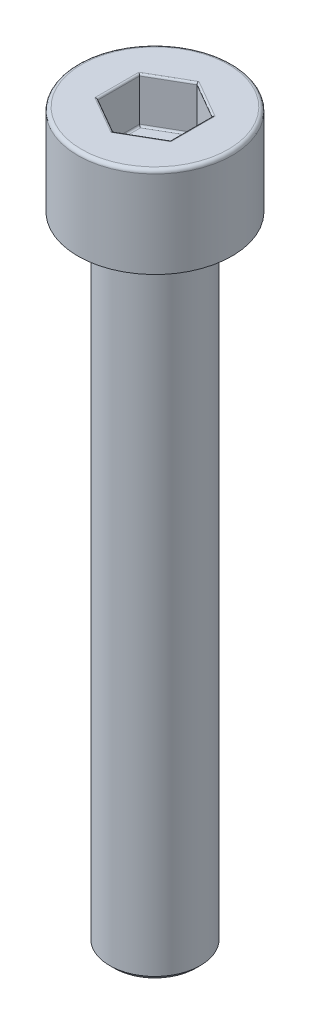
ISO-10303-21;
HEADER;
FILE_DESCRIPTION(('STEP AP214'),'2;1');
FILE_NAME('part.step','',(''),(''),'','','');
FILE_SCHEMA(('AUTOMOTIVE_DESIGN { 1 0 10303 214 1 1 1 1 }'));
ENDSEC;
DATA;
#1=APPLICATION_CONTEXT('core data for automotive mechanical design processes');
#2=APPLICATION_PROTOCOL_DEFINITION('international standard','automotive_design',2000,#1);
#3=PRODUCT_CONTEXT('',#1,'mechanical');
#4=PRODUCT('Part','Part','',(#3));
#5=PRODUCT_RELATED_PRODUCT_CATEGORY('part','',(#4));
#6=PRODUCT_DEFINITION_FORMATION('','',#4);
#7=PRODUCT_DEFINITION_CONTEXT('part definition',#1,'design');
#8=PRODUCT_DEFINITION('design','',#6,#7);
#9=PRODUCT_DEFINITION_SHAPE('','',#8);
#10=(LENGTH_UNIT() NAMED_UNIT(*) SI_UNIT(.MILLI.,.METRE.));
#11=(NAMED_UNIT(*) PLANE_ANGLE_UNIT() SI_UNIT($,.RADIAN.));
#12=(NAMED_UNIT(*) SI_UNIT($,.STERADIAN.) SOLID_ANGLE_UNIT());
#13=UNCERTAINTY_MEASURE_WITH_UNIT(LENGTH_MEASURE(1.E-05),#10,'distance_accuracy_value','');
#14=(GEOMETRIC_REPRESENTATION_CONTEXT(3) GLOBAL_UNCERTAINTY_ASSIGNED_CONTEXT((#13)) GLOBAL_UNIT_ASSIGNED_CONTEXT((#10,
#11,#12)) REPRESENTATION_CONTEXT('',''));
#15=CARTESIAN_POINT('',(0.,0.,0.));
#16=DIRECTION('',(0.,0.,1.));
#17=DIRECTION('',(1.,0.,0.));
#18=AXIS2_PLACEMENT_3D('',#15,#16,#17);
#19=CARTESIAN_POINT('',(0.,-40.,0.));
#20=DIRECTION('',(0.,-1.,0.));
#21=DIRECTION('',(0.,0.,-1.));
#22=AXIS2_PLACEMENT_3D('',#19,#20,#21);
#23=PLANE('',#22);
#24=CARTESIAN_POINT('',(0.,-40.,0.));
#25=DIRECTION('',(0.,-1.,0.));
#26=DIRECTION('',(0.,0.,-1.));
#27=AXIS2_PLACEMENT_3D('',#24,#25,#26);
#28=CIRCLE('',#27,2.25);
#29=CARTESIAN_POINT('',(0.,-40.,-2.25));
#30=VERTEX_POINT('',#29);
#31=EDGE_CURVE('E261',#30,#30,#28,.T.);
#32=ORIENTED_EDGE('',*,*,#31,.T.);
#33=EDGE_LOOP('',(#32));
#34=FACE_BOUND('',#33,.T.);
#35=ADVANCED_FACE('F33',(#34),#23,.T.);
#36=CARTESIAN_POINT('',(0.,0.,0.));
#37=DIRECTION('',(0.,1.,0.));
#38=DIRECTION('',(0.,0.,1.));
#39=AXIS2_PLACEMENT_3D('',#36,#37,#38);
#40=CYLINDRICAL_SURFACE('',#39,2.5);
#41=CARTESIAN_POINT('',(0.,-5.24999999999999,0.));
#42=DIRECTION('',(0.,-1.,0.));
#43=DIRECTION('',(0.,0.,-1.));
#44=AXIS2_PLACEMENT_3D('',#41,#42,#43);
#45=CIRCLE('',#44,2.5);
#46=CARTESIAN_POINT('',(0.,-5.24999999999999,-2.5));
#47=VERTEX_POINT('',#46);
#48=EDGE_CURVE('E258',#47,#47,#45,.T.);
#49=ORIENTED_EDGE('',*,*,#48,.T.);
#50=EDGE_LOOP('',(#49));
#51=FACE_BOUND('',#50,.T.);
#52=CARTESIAN_POINT('',(0.,-39.75,0.));
#53=DIRECTION('',(0.,-1.,0.));
#54=DIRECTION('',(0.,0.,-1.));
#55=AXIS2_PLACEMENT_3D('',#52,#53,#54);
#56=CIRCLE('',#55,2.5);
#57=CARTESIAN_POINT('',(0.,-39.75,-2.5));
#58=VERTEX_POINT('',#57);
#59=EDGE_CURVE('E255',#58,#58,#56,.F.);
#60=ORIENTED_EDGE('',*,*,#59,.T.);
#61=EDGE_LOOP('',(#60));
#62=FACE_BOUND('',#61,.T.);
#63=ADVANCED_FACE('F287',(#51,#62),#40,.T.);
#64=CARTESIAN_POINT('',(-2.5,-5.,0.));
#65=DIRECTION('',(0.,-1.,0.));
#66=DIRECTION('',(0.,0.,-1.));
#67=AXIS2_PLACEMENT_3D('',#64,#65,#66);
#68=PLANE('',#67);
#69=CARTESIAN_POINT('',(0.,-5.,0.));
#70=DIRECTION('',(0.,-1.,0.));
#71=DIRECTION('',(0.,0.,-1.));
#72=AXIS2_PLACEMENT_3D('',#69,#70,#71);
#73=CIRCLE('',#72,2.74999999999999);
#74=CARTESIAN_POINT('',(0.,-5.,-2.74999999999999));
#75=VERTEX_POINT('',#74);
#76=EDGE_CURVE('E252',#75,#75,#73,.F.);
#77=ORIENTED_EDGE('',*,*,#76,.T.);
#78=EDGE_LOOP('',(#77));
#79=FACE_BOUND('',#78,.T.);
#80=CARTESIAN_POINT('',(0.,-5.,0.));
#81=DIRECTION('',(0.,1.,0.));
#82=DIRECTION('',(0.,0.,1.));
#83=AXIS2_PLACEMENT_3D('',#80,#81,#82);
#84=CIRCLE('',#83,4.25);
#85=CARTESIAN_POINT('',(0.,-5.,4.25));
#86=VERTEX_POINT('',#85);
#87=EDGE_CURVE('E249',#86,#86,#84,.T.);
#88=ORIENTED_EDGE('',*,*,#87,.F.);
#89=EDGE_LOOP('',(#88));
#90=FACE_BOUND('',#89,.T.);
#91=ADVANCED_FACE('F293',(#79,#90),#68,.T.);
#92=CARTESIAN_POINT('',(0.,0.,0.));
#93=DIRECTION('',(0.,1.,0.));
#94=DIRECTION('',(0.,0.,1.));
#95=AXIS2_PLACEMENT_3D('',#92,#93,#94);
#96=CYLINDRICAL_SURFACE('',#95,4.25);
#97=CARTESIAN_POINT('',(0.,-0.2,0.));
#98=DIRECTION('',(0.,1.,0.));
#99=DIRECTION('',(0.,0.,1.));
#100=AXIS2_PLACEMENT_3D('',#97,#98,#99);
#101=CIRCLE('',#100,4.25);
#102=CARTESIAN_POINT('',(0.,-0.2,4.25));
#103=VERTEX_POINT('',#102);
#104=EDGE_CURVE('E159',#103,#103,#101,.F.);
#105=ORIENTED_EDGE('',*,*,#104,.T.);
#106=EDGE_LOOP('',(#105));
#107=FACE_BOUND('',#106,.T.);
#108=ORIENTED_EDGE('',*,*,#87,.T.);
#109=EDGE_LOOP('',(#108));
#110=FACE_BOUND('',#109,.T.);
#111=ADVANCED_FACE('F303',(#107,#110),#96,.T.);
#112=CARTESIAN_POINT('',(-4.25,0.,0.));
#113=DIRECTION('',(0.,1.,0.));
#114=DIRECTION('',(0.,0.,1.));
#115=AXIS2_PLACEMENT_3D('',#112,#113,#114);
#116=PLANE('',#115);
#117=DIRECTION('',(0.,0.,1.));
#118=VECTOR('',#117,1.);
#119=CARTESIAN_POINT('',(-2.1,0.,-1.15470053837925));
#120=LINE('',#119,#118);
#121=CARTESIAN_POINT('',(-2.1,0.,1.21243556529821));
#122=VERTEX_POINT('',#121);
#123=CARTESIAN_POINT('',(-2.1,0.,-1.21243556529822));
#124=VERTEX_POINT('',#123);
#125=EDGE_CURVE('E175',#122,#124,#120,.F.);
#126=ORIENTED_EDGE('',*,*,#125,.T.);
#127=DIRECTION('',(-0.866025403784439,0.,0.5));
#128=VECTOR('',#127,1.);
#129=CARTESIAN_POINT('',(-0.0500000000000002,0.,-2.39600361713695));
#130=LINE('',#129,#128);
#131=CARTESIAN_POINT('',(0.,0.,-2.42487113059643));
#132=VERTEX_POINT('',#131);
#133=EDGE_CURVE('E134',#124,#132,#130,.F.);
#134=ORIENTED_EDGE('',*,*,#133,.T.);
#135=DIRECTION('',(-0.866025403784439,0.,-0.5));
#136=VECTOR('',#135,1.);
#137=CARTESIAN_POINT('',(2.05,0.,-1.2413030787577));
#138=LINE('',#137,#136);
#139=CARTESIAN_POINT('',(2.1,0.,-1.21243556529821));
#140=VERTEX_POINT('',#139);
#141=EDGE_CURVE('E161',#132,#140,#138,.F.);
#142=ORIENTED_EDGE('',*,*,#141,.T.);
#143=DIRECTION('',(0.,0.,-1.));
#144=VECTOR('',#143,1.);
#145=CARTESIAN_POINT('',(2.1,0.,1.15470053837925));
#146=LINE('',#145,#144);
#147=CARTESIAN_POINT('',(2.1,0.,1.21243556529821));
#148=VERTEX_POINT('',#147);
#149=EDGE_CURVE('E169',#140,#148,#146,.F.);
#150=ORIENTED_EDGE('',*,*,#149,.T.);
#151=DIRECTION('',(0.866025403784439,0.,-0.5));
#152=VECTOR('',#151,1.);
#153=CARTESIAN_POINT('',(0.0499999999999985,0.,2.39600361713695));
#154=LINE('',#153,#152);
#155=CARTESIAN_POINT('',(0.,0.,2.42487113059643));
#156=VERTEX_POINT('',#155);
#157=EDGE_CURVE('E171',#148,#156,#154,.F.);
#158=ORIENTED_EDGE('',*,*,#157,.T.);
#159=DIRECTION('',(0.866025403784439,0.,0.5));
#160=VECTOR('',#159,1.);
#161=CARTESIAN_POINT('',(-2.05,0.,1.2413030787577));
#162=LINE('',#161,#160);
#163=EDGE_CURVE('E173',#156,#122,#162,.F.);
#164=ORIENTED_EDGE('',*,*,#163,.T.);
#165=EDGE_LOOP('',(#126,#134,#142,#150,#158,#164));
#166=FACE_BOUND('',#165,.T.);
#167=CARTESIAN_POINT('',(0.,0.,0.));
#168=DIRECTION('',(0.,1.,0.));
#169=DIRECTION('',(0.,0.,1.));
#170=AXIS2_PLACEMENT_3D('',#167,#168,#169);
#171=CIRCLE('',#170,4.05);
#172=CARTESIAN_POINT('',(0.,0.,4.05));
#173=VERTEX_POINT('',#172);
#174=EDGE_CURVE('E164',#173,#173,#171,.T.);
#175=ORIENTED_EDGE('',*,*,#174,.T.);
#176=EDGE_LOOP('',(#175));
#177=FACE_BOUND('',#176,.T.);
#178=ADVANCED_FACE('F266',(#166,#177),#116,.T.);
#179=CARTESIAN_POINT('',(0.,-5.,0.));
#180=DIRECTION('',(0.,1.,0.));
#181=DIRECTION('',(0.,0.,1.));
#182=AXIS2_PLACEMENT_3D('',#179,#180,#181);
#183=CONICAL_SURFACE('',#182,2.74999999999999,0.785398163397452);
#184=ORIENTED_EDGE('',*,*,#48,.F.);
#185=EDGE_LOOP('',(#184));
#186=FACE_BOUND('',#185,.T.);
#187=ORIENTED_EDGE('',*,*,#76,.F.);
#188=EDGE_LOOP('',(#187));
#189=FACE_BOUND('',#188,.T.);
#190=ADVANCED_FACE('F281',(#186,#189),#183,.T.);
#191=CARTESIAN_POINT('',(0.,-39.75,0.));
#192=DIRECTION('',(0.,1.,0.));
#193=DIRECTION('',(0.,0.,1.));
#194=AXIS2_PLACEMENT_3D('',#191,#192,#193);
#195=CONICAL_SURFACE('',#194,2.5,0.785398163397435);
#196=ORIENTED_EDGE('',*,*,#31,.F.);
#197=EDGE_LOOP('',(#196));
#198=FACE_BOUND('',#197,.T.);
#199=ORIENTED_EDGE('',*,*,#59,.F.);
#200=EDGE_LOOP('',(#199));
#201=FACE_BOUND('',#200,.T.);
#202=ADVANCED_FACE('F271',(#198,#201),#195,.T.);
#203=CARTESIAN_POINT('',(0.,-0.2,0.));
#204=DIRECTION('',(0.,1.,0.));
#205=DIRECTION('',(0.,0.,1.));
#206=AXIS2_PLACEMENT_3D('',#203,#204,#205);
#207=TOROIDAL_SURFACE('',#206,4.05,0.2);
#208=ORIENTED_EDGE('',*,*,#104,.F.);
#209=EDGE_LOOP('',(#208));
#210=FACE_BOUND('',#209,.T.);
#211=ORIENTED_EDGE('',*,*,#174,.F.);
#212=EDGE_LOOP('',(#211));
#213=FACE_BOUND('',#212,.T.);
#214=ADVANCED_FACE('F268',(#210,#213),#207,.T.);
#215=CARTESIAN_POINT('',(2.,-2.5,-1.15470053837925));
#216=DIRECTION('',(0.5,0.,-0.866025403784439));
#217=DIRECTION('',(-0.866025403784439,0.,-0.5));
#218=AXIS2_PLACEMENT_3D('',#215,#216,#217);
#219=PLANE('',#218);
#220=DIRECTION('',(0.,1.,0.));
#221=VECTOR('',#220,1.);
#222=CARTESIAN_POINT('',(2.,-2.5,-1.15470053837925));
#223=LINE('',#222,#221);
#224=CARTESIAN_POINT('',(2.,-2.4,-1.15470053837925));
#225=VERTEX_POINT('',#224);
#226=CARTESIAN_POINT('',(2.,-0.0999999999999998,-1.15470053837925));
#227=VERTEX_POINT('',#226);
#228=EDGE_CURVE('E243',#225,#227,#223,.T.);
#229=ORIENTED_EDGE('',*,*,#228,.T.);
#230=DIRECTION('',(-0.866025403784439,0.,-0.5));
#231=VECTOR('',#230,1.);
#232=CARTESIAN_POINT('',(0.,-0.0999999999999998,-2.3094010767585));
#233=LINE('',#232,#231);
#234=CARTESIAN_POINT('',(0.,-0.0999999999999998,-2.3094010767585));
#235=VERTEX_POINT('',#234);
#236=EDGE_CURVE('E195',#227,#235,#233,.T.);
#237=ORIENTED_EDGE('',*,*,#236,.T.);
#238=DIRECTION('',(0.,1.,0.));
#239=VECTOR('',#238,1.);
#240=CARTESIAN_POINT('',(0.,-2.5,-2.3094010767585));
#241=LINE('',#240,#239);
#242=CARTESIAN_POINT('',(0.,-2.4,-2.3094010767585));
#243=VERTEX_POINT('',#242);
#244=EDGE_CURVE('E145',#243,#235,#241,.T.);
#245=ORIENTED_EDGE('',*,*,#244,.F.);
#246=DIRECTION('',(-0.866025403784439,0.,-0.5));
#247=VECTOR('',#246,1.);
#248=CARTESIAN_POINT('',(2.,-2.4,-1.15470053837925));
#249=LINE('',#248,#247);
#250=EDGE_CURVE('E193',#243,#225,#249,.F.);
#251=ORIENTED_EDGE('',*,*,#250,.T.);
#252=EDGE_LOOP('',(#229,#237,#245,#251));
#253=FACE_BOUND('',#252,.T.);
#254=ADVANCED_FACE('F270',(#253),#219,.F.);
#255=CARTESIAN_POINT('',(2.,-2.5,1.15470053837925));
#256=DIRECTION('',(1.,0.,0.));
#257=DIRECTION('',(0.,0.,-1.));
#258=AXIS2_PLACEMENT_3D('',#255,#256,#257);
#259=PLANE('',#258);
#260=DIRECTION('',(0.,1.,0.));
#261=VECTOR('',#260,1.);
#262=CARTESIAN_POINT('',(2.,-2.5,1.15470053837925));
#263=LINE('',#262,#261);
#264=CARTESIAN_POINT('',(2.,-2.4,1.15470053837925));
#265=VERTEX_POINT('',#264);
#266=CARTESIAN_POINT('',(2.,-0.0999999999999998,1.15470053837925));
#267=VERTEX_POINT('',#266);
#268=EDGE_CURVE('E240',#265,#267,#263,.T.);
#269=ORIENTED_EDGE('',*,*,#268,.T.);
#270=DIRECTION('',(0.,0.,-1.));
#271=VECTOR('',#270,1.);
#272=CARTESIAN_POINT('',(2.,-0.0999999999999998,-1.15470053837925));
#273=LINE('',#272,#271);
#274=EDGE_CURVE('E191',#267,#227,#273,.T.);
#275=ORIENTED_EDGE('',*,*,#274,.T.);
#276=ORIENTED_EDGE('',*,*,#228,.F.);
#277=DIRECTION('',(0.,0.,-1.));
#278=VECTOR('',#277,1.);
#279=CARTESIAN_POINT('',(2.,-2.4,1.15470053837925));
#280=LINE('',#279,#278);
#281=EDGE_CURVE('E188',#225,#265,#280,.F.);
#282=ORIENTED_EDGE('',*,*,#281,.T.);
#283=EDGE_LOOP('',(#269,#275,#276,#282));
#284=FACE_BOUND('',#283,.T.);
#285=ADVANCED_FACE('F278',(#284),#259,.F.);
#286=CARTESIAN_POINT('',(0.,-2.5,2.3094010767585));
#287=DIRECTION('',(0.5,0.,0.866025403784439));
#288=DIRECTION('',(0.866025403784439,0.,-0.5));
#289=AXIS2_PLACEMENT_3D('',#286,#287,#288);
#290=PLANE('',#289);
#291=DIRECTION('',(0.,1.,0.));
#292=VECTOR('',#291,1.);
#293=CARTESIAN_POINT('',(0.,-2.5,2.3094010767585));
#294=LINE('',#293,#292);
#295=CARTESIAN_POINT('',(0.,-2.4,2.3094010767585));
#296=VERTEX_POINT('',#295);
#297=CARTESIAN_POINT('',(0.,-0.0999999999999998,2.3094010767585));
#298=VERTEX_POINT('',#297);
#299=EDGE_CURVE('E237',#296,#298,#294,.T.);
#300=ORIENTED_EDGE('',*,*,#299,.T.);
#301=DIRECTION('',(0.866025403784439,0.,-0.5));
#302=VECTOR('',#301,1.);
#303=CARTESIAN_POINT('',(2.,-0.0999999999999998,1.15470053837925));
#304=LINE('',#303,#302);
#305=EDGE_CURVE('E186',#298,#267,#304,.T.);
#306=ORIENTED_EDGE('',*,*,#305,.T.);
#307=ORIENTED_EDGE('',*,*,#268,.F.);
#308=DIRECTION('',(0.866025403784439,0.,-0.5));
#309=VECTOR('',#308,1.);
#310=CARTESIAN_POINT('',(0.,-2.4,2.3094010767585));
#311=LINE('',#310,#309);
#312=EDGE_CURVE('E184',#265,#296,#311,.F.);
#313=ORIENTED_EDGE('',*,*,#312,.T.);
#314=EDGE_LOOP('',(#300,#306,#307,#313));
#315=FACE_BOUND('',#314,.T.);
#316=ADVANCED_FACE('F327',(#315),#290,.F.);
#317=CARTESIAN_POINT('',(-2.,-2.5,1.15470053837925));
#318=DIRECTION('',(-0.5,0.,0.866025403784438));
#319=DIRECTION('',(0.866025403784439,0.,0.5));
#320=AXIS2_PLACEMENT_3D('',#317,#318,#319);
#321=PLANE('',#320);
#322=DIRECTION('',(0.,1.,0.));
#323=VECTOR('',#322,1.);
#324=CARTESIAN_POINT('',(-2.,-2.5,1.15470053837925));
#325=LINE('',#324,#323);
#326=CARTESIAN_POINT('',(-2.,-2.4,1.15470053837925));
#327=VERTEX_POINT('',#326);
#328=CARTESIAN_POINT('',(-2.,-0.0999999999999998,1.15470053837925));
#329=VERTEX_POINT('',#328);
#330=EDGE_CURVE('E128',#327,#329,#325,.T.);
#331=ORIENTED_EDGE('',*,*,#330,.T.);
#332=DIRECTION('',(0.866025403784439,0.,0.5));
#333=VECTOR('',#332,1.);
#334=CARTESIAN_POINT('',(0.,-0.0999999999999998,2.3094010767585));
#335=LINE('',#334,#333);
#336=EDGE_CURVE('E182',#329,#298,#335,.T.);
#337=ORIENTED_EDGE('',*,*,#336,.T.);
#338=ORIENTED_EDGE('',*,*,#299,.F.);
#339=DIRECTION('',(0.866025403784439,0.,0.5));
#340=VECTOR('',#339,1.);
#341=CARTESIAN_POINT('',(-2.,-2.4,1.15470053837925));
#342=LINE('',#341,#340);
#343=EDGE_CURVE('E180',#296,#327,#342,.F.);
#344=ORIENTED_EDGE('',*,*,#343,.T.);
#345=EDGE_LOOP('',(#331,#337,#338,#344));
#346=FACE_BOUND('',#345,.T.);
#347=ADVANCED_FACE('F234',(#346),#321,.F.);
#348=CARTESIAN_POINT('',(-2.,-2.5,-1.15470053837925));
#349=DIRECTION('',(-1.,0.,0.));
#350=DIRECTION('',(0.,0.,1.));
#351=AXIS2_PLACEMENT_3D('',#348,#349,#350);
#352=PLANE('',#351);
#353=DIRECTION('',(0.,1.,0.));
#354=VECTOR('',#353,1.);
#355=CARTESIAN_POINT('',(-2.,-2.5,-1.15470053837925));
#356=LINE('',#355,#354);
#357=CARTESIAN_POINT('',(-2.,-2.4,-1.15470053837925));
#358=VERTEX_POINT('',#357);
#359=CARTESIAN_POINT('',(-2.,-0.0999999999999998,-1.15470053837925));
#360=VERTEX_POINT('',#359);
#361=EDGE_CURVE('E126',#358,#360,#356,.T.);
#362=ORIENTED_EDGE('',*,*,#361,.T.);
#363=DIRECTION('',(0.,0.,1.));
#364=VECTOR('',#363,1.);
#365=CARTESIAN_POINT('',(-2.,-0.0999999999999998,1.15470053837925));
#366=LINE('',#365,#364);
#367=EDGE_CURVE('E133',#360,#329,#366,.T.);
#368=ORIENTED_EDGE('',*,*,#367,.T.);
#369=ORIENTED_EDGE('',*,*,#330,.F.);
#370=DIRECTION('',(0.,0.,1.));
#371=VECTOR('',#370,1.);
#372=CARTESIAN_POINT('',(-2.,-2.4,-1.15470053837925));
#373=LINE('',#372,#371);
#374=EDGE_CURVE('E123',#327,#358,#373,.F.);
#375=ORIENTED_EDGE('',*,*,#374,.T.);
#376=EDGE_LOOP('',(#362,#368,#369,#375));
#377=FACE_BOUND('',#376,.T.);
#378=ADVANCED_FACE('F125',(#377),#352,.F.);
#379=CARTESIAN_POINT('',(0.,-2.5,-2.3094010767585));
#380=DIRECTION('',(-0.5,0.,-0.866025403784439));
#381=DIRECTION('',(-0.866025403784439,0.,0.5));
#382=AXIS2_PLACEMENT_3D('',#379,#380,#381);
#383=PLANE('',#382);
#384=ORIENTED_EDGE('',*,*,#244,.T.);
#385=DIRECTION('',(-0.866025403784439,0.,0.5));
#386=VECTOR('',#385,1.);
#387=CARTESIAN_POINT('',(-2.,-0.0999999999999998,-1.15470053837925));
#388=LINE('',#387,#386);
#389=EDGE_CURVE('E144',#235,#360,#388,.T.);
#390=ORIENTED_EDGE('',*,*,#389,.T.);
#391=ORIENTED_EDGE('',*,*,#361,.F.);
#392=DIRECTION('',(-0.866025403784439,0.,0.5));
#393=VECTOR('',#392,1.);
#394=CARTESIAN_POINT('',(0.,-2.4,-2.3094010767585));
#395=LINE('',#394,#393);
#396=EDGE_CURVE('E141',#358,#243,#395,.F.);
#397=ORIENTED_EDGE('',*,*,#396,.T.);
#398=EDGE_LOOP('',(#384,#390,#391,#397));
#399=FACE_BOUND('',#398,.T.);
#400=ADVANCED_FACE('F139',(#399),#383,.F.);
#401=CARTESIAN_POINT('',(2.,-2.5,-1.15470053837925));
#402=DIRECTION('',(0.,-1.,0.));
#403=DIRECTION('',(0.,0.,-1.));
#404=AXIS2_PLACEMENT_3D('',#401,#402,#403);
#405=PLANE('',#404);
#406=DIRECTION('',(0.866025403784439,0.,-0.5));
#407=VECTOR('',#406,1.);
#408=CARTESIAN_POINT('',(1.95,-2.5,1.06809799800081));
#409=LINE('',#408,#407);
#410=CARTESIAN_POINT('',(0.,-2.5,2.19393102292058));
#411=VERTEX_POINT('',#410);
#412=CARTESIAN_POINT('',(1.9,-2.5,1.09696551146029));
#413=VERTEX_POINT('',#412);
#414=EDGE_CURVE('E42',#411,#413,#409,.T.);
#415=ORIENTED_EDGE('',*,*,#414,.T.);
#416=DIRECTION('',(0.,0.,-1.));
#417=VECTOR('',#416,1.);
#418=CARTESIAN_POINT('',(1.9,-2.5,-1.15470053837925));
#419=LINE('',#418,#417);
#420=CARTESIAN_POINT('',(1.9,-2.5,-1.09696551146029));
#421=VERTEX_POINT('',#420);
#422=EDGE_CURVE('E11',#413,#421,#419,.T.);
#423=ORIENTED_EDGE('',*,*,#422,.T.);
#424=DIRECTION('',(-0.866025403784439,0.,-0.5));
#425=VECTOR('',#424,1.);
#426=CARTESIAN_POINT('',(-0.0499999999999999,-2.5,-2.22279853638006));
#427=LINE('',#426,#425);
#428=CARTESIAN_POINT('',(0.,-2.5,-2.19393102292058));
#429=VERTEX_POINT('',#428);
#430=EDGE_CURVE('E197',#421,#429,#427,.T.);
#431=ORIENTED_EDGE('',*,*,#430,.T.);
#432=DIRECTION('',(-0.866025403784439,0.,0.5));
#433=VECTOR('',#432,1.);
#434=CARTESIAN_POINT('',(-1.95,-2.5,-1.06809799800081));
#435=LINE('',#434,#433);
#436=CARTESIAN_POINT('',(-1.9,-2.5,-1.09696551146029));
#437=VERTEX_POINT('',#436);
#438=EDGE_CURVE('E199',#429,#437,#435,.T.);
#439=ORIENTED_EDGE('',*,*,#438,.T.);
#440=DIRECTION('',(0.,0.,1.));
#441=VECTOR('',#440,1.);
#442=CARTESIAN_POINT('',(-1.9,-2.5,1.15470053837925));
#443=LINE('',#442,#441);
#444=CARTESIAN_POINT('',(-1.9,-2.5,1.09696551146029));
#445=VERTEX_POINT('',#444);
#446=EDGE_CURVE('E150',#437,#445,#443,.T.);
#447=ORIENTED_EDGE('',*,*,#446,.T.);
#448=DIRECTION('',(0.866025403784439,0.,0.5));
#449=VECTOR('',#448,1.);
#450=CARTESIAN_POINT('',(0.0499999999999985,-2.5,2.22279853638006));
#451=LINE('',#450,#449);
#452=EDGE_CURVE('E53',#445,#411,#451,.T.);
#453=ORIENTED_EDGE('',*,*,#452,.T.);
#454=EDGE_LOOP('',(#415,#423,#431,#439,#447,#453));
#455=FACE_BOUND('',#454,.T.);
#456=ADVANCED_FACE('F322',(#455),#405,.F.);
#457=CARTESIAN_POINT('',(0.0499999999999984,-0.0999999999999998,2.39600361713695));
#458=DIRECTION('',(-0.866025403784439,0.,0.5));
#459=DIRECTION('',(0.5,0.,0.866025403784439));
#460=AXIS2_PLACEMENT_3D('',#457,#458,#459);
#461=CYLINDRICAL_SURFACE('',#460,0.1);
#462=CARTESIAN_POINT('',(0.,-0.0999999999999998,2.42487113059643));
#463=DIRECTION('',(-1.,0.,0.));
#464=DIRECTION('',(0.,0.,-1.));
#465=AXIS2_PLACEMENT_3D('',#462,#463,#464);
#466=ELLIPSE('',#465,0.115470053837925,0.1);
#467=EDGE_CURVE('E214',#156,#298,#466,.T.);
#468=ORIENTED_EDGE('',*,*,#467,.F.);
#469=ORIENTED_EDGE('',*,*,#157,.F.);
#470=CARTESIAN_POINT('',(2.1,-0.0999999999999998,1.21243556529821));
#471=DIRECTION('',(-0.5,0.,0.866025403784438));
#472=DIRECTION('',(-0.866025403784438,0.,-0.5));
#473=AXIS2_PLACEMENT_3D('',#470,#471,#472);
#474=ELLIPSE('',#473,0.115470053837925,0.1);
#475=EDGE_CURVE('E217',#267,#148,#474,.F.);
#476=ORIENTED_EDGE('',*,*,#475,.F.);
#477=ORIENTED_EDGE('',*,*,#305,.F.);
#478=EDGE_LOOP('',(#468,#469,#476,#477));
#479=FACE_BOUND('',#478,.T.);
#480=ADVANCED_FACE('F334',(#479),#461,.T.);
#481=CARTESIAN_POINT('',(2.1,-0.0999999999999998,1.15470053837925));
#482=DIRECTION('',(0.,0.,1.));
#483=DIRECTION('',(1.,0.,0.));
#484=AXIS2_PLACEMENT_3D('',#481,#482,#483);
#485=CYLINDRICAL_SURFACE('',#484,0.1);
#486=ORIENTED_EDGE('',*,*,#475,.T.);
#487=ORIENTED_EDGE('',*,*,#149,.F.);
#488=CARTESIAN_POINT('',(2.1,-0.0999999999999998,-1.21243556529821));
#489=DIRECTION('',(0.5,0.,0.866025403784439));
#490=DIRECTION('',(-0.866025403784439,0.,0.5));
#491=AXIS2_PLACEMENT_3D('',#488,#489,#490);
#492=ELLIPSE('',#491,0.115470053837925,0.1);
#493=EDGE_CURVE('E211',#227,#140,#492,.F.);
#494=ORIENTED_EDGE('',*,*,#493,.F.);
#495=ORIENTED_EDGE('',*,*,#274,.F.);
#496=EDGE_LOOP('',(#486,#487,#494,#495));
#497=FACE_BOUND('',#496,.T.);
#498=ADVANCED_FACE('F338',(#497),#485,.T.);
#499=CARTESIAN_POINT('',(-2.05,-0.0999999999999998,1.2413030787577));
#500=DIRECTION('',(-0.866025403784439,0.,-0.5));
#501=DIRECTION('',(-0.5,0.,0.866025403784438));
#502=AXIS2_PLACEMENT_3D('',#499,#500,#501);
#503=CYLINDRICAL_SURFACE('',#502,0.1);
#504=ORIENTED_EDGE('',*,*,#467,.T.);
#505=ORIENTED_EDGE('',*,*,#336,.F.);
#506=CARTESIAN_POINT('',(-2.1,-0.0999999999999998,1.21243556529821));
#507=DIRECTION('',(-0.5,0.,-0.866025403784439));
#508=DIRECTION('',(0.866025403784439,0.,-0.5));
#509=AXIS2_PLACEMENT_3D('',#506,#507,#508);
#510=ELLIPSE('',#509,0.115470053837925,0.1);
#511=EDGE_CURVE('E208',#122,#329,#510,.T.);
#512=ORIENTED_EDGE('',*,*,#511,.F.);
#513=ORIENTED_EDGE('',*,*,#163,.F.);
#514=EDGE_LOOP('',(#504,#505,#512,#513));
#515=FACE_BOUND('',#514,.T.);
#516=ADVANCED_FACE('F344',(#515),#503,.T.);
#517=CARTESIAN_POINT('',(2.05,-0.0999999999999998,-1.2413030787577));
#518=DIRECTION('',(0.866025403784439,0.,0.5));
#519=DIRECTION('',(0.5,0.,-0.866025403784439));
#520=AXIS2_PLACEMENT_3D('',#517,#518,#519);
#521=CYLINDRICAL_SURFACE('',#520,0.1);
#522=ORIENTED_EDGE('',*,*,#493,.T.);
#523=ORIENTED_EDGE('',*,*,#141,.F.);
#524=CARTESIAN_POINT('',(0.,-0.0999999999999998,-2.42487113059643));
#525=DIRECTION('',(1.,0.,0.));
#526=DIRECTION('',(0.,0.,-1.));
#527=AXIS2_PLACEMENT_3D('',#524,#525,#526);
#528=ELLIPSE('',#527,0.115470053837925,0.1);
#529=EDGE_CURVE('E206',#235,#132,#528,.F.);
#530=ORIENTED_EDGE('',*,*,#529,.F.);
#531=ORIENTED_EDGE('',*,*,#236,.F.);
#532=EDGE_LOOP('',(#522,#523,#530,#531));
#533=FACE_BOUND('',#532,.T.);
#534=ADVANCED_FACE('F374',(#533),#521,.T.);
#535=CARTESIAN_POINT('',(-2.1,-0.0999999999999998,-1.15470053837925));
#536=DIRECTION('',(0.,0.,-1.));
#537=DIRECTION('',(-1.,0.,0.));
#538=AXIS2_PLACEMENT_3D('',#535,#536,#537);
#539=CYLINDRICAL_SURFACE('',#538,0.1);
#540=ORIENTED_EDGE('',*,*,#511,.T.);
#541=ORIENTED_EDGE('',*,*,#367,.F.);
#542=CARTESIAN_POINT('',(-2.1,-0.0999999999999998,-1.21243556529822));
#543=DIRECTION('',(0.5,0.,-0.866025403784438));
#544=DIRECTION('',(0.866025403784439,0.,0.5));
#545=AXIS2_PLACEMENT_3D('',#542,#543,#544);
#546=ELLIPSE('',#545,0.115470053837925,0.1);
#547=EDGE_CURVE('E204',#124,#360,#546,.T.);
#548=ORIENTED_EDGE('',*,*,#547,.F.);
#549=ORIENTED_EDGE('',*,*,#125,.F.);
#550=EDGE_LOOP('',(#540,#541,#548,#549));
#551=FACE_BOUND('',#550,.T.);
#552=ADVANCED_FACE('F369',(#551),#539,.T.);
#553=CARTESIAN_POINT('',(-0.0499999999999999,-0.0999999999999998,-2.39600361713695));
#554=DIRECTION('',(0.866025403784439,0.,-0.5));
#555=DIRECTION('',(-0.5,0.,-0.866025403784439));
#556=AXIS2_PLACEMENT_3D('',#553,#554,#555);
#557=CYLINDRICAL_SURFACE('',#556,0.1);
#558=ORIENTED_EDGE('',*,*,#529,.T.);
#559=ORIENTED_EDGE('',*,*,#133,.F.);
#560=ORIENTED_EDGE('',*,*,#547,.T.);
#561=ORIENTED_EDGE('',*,*,#389,.F.);
#562=EDGE_LOOP('',(#558,#559,#560,#561));
#563=FACE_BOUND('',#562,.T.);
#564=ADVANCED_FACE('F365',(#563),#557,.T.);
#565=CARTESIAN_POINT('',(-1.9,-2.4,-1.15470053837925));
#566=DIRECTION('',(0.,0.,-1.));
#567=DIRECTION('',(-1.,0.,0.));
#568=AXIS2_PLACEMENT_3D('',#565,#566,#567);
#569=CYLINDRICAL_SURFACE('',#568,0.1);
#570=CARTESIAN_POINT('',(-1.9,-2.4,-1.09696551146029));
#571=DIRECTION('',(0.5,0.,-0.866025403784438));
#572=DIRECTION('',(-0.866025403784439,0.,-0.5));
#573=AXIS2_PLACEMENT_3D('',#570,#571,#572);
#574=ELLIPSE('',#573,0.115470053837925,0.1);
#575=EDGE_CURVE('E149',#358,#437,#574,.F.);
#576=ORIENTED_EDGE('',*,*,#575,.F.);
#577=ORIENTED_EDGE('',*,*,#374,.F.);
#578=CARTESIAN_POINT('',(-1.9,-2.4,1.09696551146029));
#579=DIRECTION('',(-0.5,0.,-0.866025403784439));
#580=DIRECTION('',(-0.866025403784439,0.,0.5));
#581=AXIS2_PLACEMENT_3D('',#578,#579,#580);
#582=ELLIPSE('',#581,0.115470053837925,0.1);
#583=EDGE_CURVE('E37',#445,#327,#582,.T.);
#584=ORIENTED_EDGE('',*,*,#583,.F.);
#585=ORIENTED_EDGE('',*,*,#446,.F.);
#586=EDGE_LOOP('',(#576,#577,#584,#585));
#587=FACE_BOUND('',#586,.T.);
#588=ADVANCED_FACE('F35',(#587),#569,.F.);
#589=CARTESIAN_POINT('',(0.0499999999999982,-2.4,2.22279853638006));
#590=DIRECTION('',(-0.866025403784439,0.,-0.5));
#591=DIRECTION('',(-0.5,0.,0.866025403784438));
#592=AXIS2_PLACEMENT_3D('',#589,#590,#591);
#593=CYLINDRICAL_SURFACE('',#592,0.1);
#594=ORIENTED_EDGE('',*,*,#583,.T.);
#595=ORIENTED_EDGE('',*,*,#343,.F.);
#596=CARTESIAN_POINT('',(0.,-2.4,2.19393102292058));
#597=DIRECTION('',(-1.,0.,0.));
#598=DIRECTION('',(0.,0.,1.));
#599=AXIS2_PLACEMENT_3D('',#596,#597,#598);
#600=ELLIPSE('',#599,0.115470053837925,0.1);
#601=EDGE_CURVE('E153',#411,#296,#600,.T.);
#602=ORIENTED_EDGE('',*,*,#601,.F.);
#603=ORIENTED_EDGE('',*,*,#452,.F.);
#604=EDGE_LOOP('',(#594,#595,#602,#603));
#605=FACE_BOUND('',#604,.T.);
#606=ADVANCED_FACE('F231',(#605),#593,.F.);
#607=CARTESIAN_POINT('',(1.05,-2.4,-2.80014880556968));
#608=DIRECTION('',(0.866025403784439,0.,-0.5));
#609=DIRECTION('',(-0.5,0.,-0.866025403784439));
#610=AXIS2_PLACEMENT_3D('',#607,#608,#609);
#611=CYLINDRICAL_SURFACE('',#610,0.1);
#612=ORIENTED_EDGE('',*,*,#575,.T.);
#613=ORIENTED_EDGE('',*,*,#438,.F.);
#614=CARTESIAN_POINT('',(0.,-2.4,-2.19393102292058));
#615=DIRECTION('',(1.,0.,0.));
#616=DIRECTION('',(0.,0.,-1.));
#617=AXIS2_PLACEMENT_3D('',#614,#615,#616);
#618=ELLIPSE('',#617,0.115470053837925,0.1);
#619=EDGE_CURVE('E157',#243,#429,#618,.F.);
#620=ORIENTED_EDGE('',*,*,#619,.F.);
#621=ORIENTED_EDGE('',*,*,#396,.F.);
#622=EDGE_LOOP('',(#612,#613,#620,#621));
#623=FACE_BOUND('',#622,.T.);
#624=ADVANCED_FACE('F155',(#623),#611,.F.);
#625=CARTESIAN_POINT('',(2.95,-2.4,0.490747728811183));
#626=DIRECTION('',(-0.866025403784439,0.,0.5));
#627=DIRECTION('',(0.5,0.,0.866025403784439));
#628=AXIS2_PLACEMENT_3D('',#625,#626,#627);
#629=CYLINDRICAL_SURFACE('',#628,0.1);
#630=ORIENTED_EDGE('',*,*,#601,.T.);
#631=ORIENTED_EDGE('',*,*,#312,.F.);
#632=CARTESIAN_POINT('',(1.9,-2.4,1.09696551146029));
#633=DIRECTION('',(-0.5,0.,0.866025403784438));
#634=DIRECTION('',(0.866025403784438,0.,0.5));
#635=AXIS2_PLACEMENT_3D('',#632,#633,#634);
#636=ELLIPSE('',#635,0.115470053837925,0.1);
#637=EDGE_CURVE('E222',#413,#265,#636,.T.);
#638=ORIENTED_EDGE('',*,*,#637,.F.);
#639=ORIENTED_EDGE('',*,*,#414,.F.);
#640=EDGE_LOOP('',(#630,#631,#638,#639));
#641=FACE_BOUND('',#640,.T.);
#642=ADVANCED_FACE('F228',(#641),#629,.F.);
#643=CARTESIAN_POINT('',(1.95,-2.4,-1.06809799800081));
#644=DIRECTION('',(0.866025403784439,0.,0.5));
#645=DIRECTION('',(0.5,0.,-0.866025403784439));
#646=AXIS2_PLACEMENT_3D('',#643,#644,#645);
#647=CYLINDRICAL_SURFACE('',#646,0.1);
#648=ORIENTED_EDGE('',*,*,#619,.T.);
#649=ORIENTED_EDGE('',*,*,#430,.F.);
#650=CARTESIAN_POINT('',(1.9,-2.4,-1.09696551146029));
#651=DIRECTION('',(0.5,0.,0.866025403784439));
#652=DIRECTION('',(-0.866025403784439,0.,0.5));
#653=AXIS2_PLACEMENT_3D('',#650,#651,#652);
#654=ELLIPSE('',#653,0.115470053837925,0.1);
#655=EDGE_CURVE('E220',#225,#421,#654,.F.);
#656=ORIENTED_EDGE('',*,*,#655,.F.);
#657=ORIENTED_EDGE('',*,*,#250,.F.);
#658=EDGE_LOOP('',(#648,#649,#656,#657));
#659=FACE_BOUND('',#658,.T.);
#660=ADVANCED_FACE('F353',(#659),#647,.F.);
#661=CARTESIAN_POINT('',(1.9,-2.4,-1.15470053837925));
#662=DIRECTION('',(0.,0.,1.));
#663=DIRECTION('',(1.,0.,0.));
#664=AXIS2_PLACEMENT_3D('',#661,#662,#663);
#665=CYLINDRICAL_SURFACE('',#664,0.1);
#666=ORIENTED_EDGE('',*,*,#637,.T.);
#667=ORIENTED_EDGE('',*,*,#281,.F.);
#668=ORIENTED_EDGE('',*,*,#655,.T.);
#669=ORIENTED_EDGE('',*,*,#422,.F.);
#670=EDGE_LOOP('',(#666,#667,#668,#669));
#671=FACE_BOUND('',#670,.T.);
#672=ADVANCED_FACE('F350',(#671),#665,.F.);
#673=CLOSED_SHELL('',(#35,#63,#91,#111,#178,#190,#202,#214,#254,#285,#316,#347,#378,#400,#456,
#480,#498,#516,#534,#552,#564,#588,#606,#624,#642,#660,#672));
#674=MANIFOLD_SOLID_BREP('B2',#673);
#675=ADVANCED_BREP_SHAPE_REPRESENTATION('',(#18,#674),#14);
#676=SHAPE_DEFINITION_REPRESENTATION(#9,#675);
ENDSEC;
END-ISO-10303-21;
